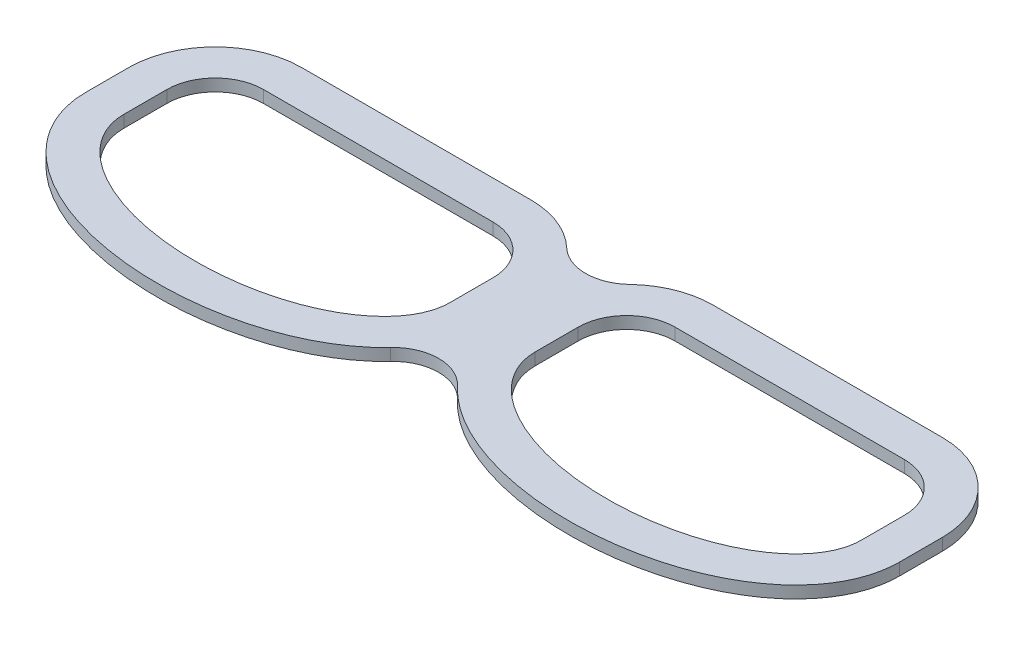
ISO-10303-21;
HEADER;
FILE_DESCRIPTION(('STEP AP214'),'2;1');
FILE_NAME('part.step','',(''),(''),'','','');
FILE_SCHEMA(('AUTOMOTIVE_DESIGN { 1 0 10303 214 1 1 1 1 }'));
ENDSEC;
DATA;
#1=APPLICATION_CONTEXT('core data for automotive mechanical design processes');
#2=APPLICATION_PROTOCOL_DEFINITION('international standard','automotive_design',2000,#1);
#3=PRODUCT_CONTEXT('',#1,'mechanical');
#4=PRODUCT('Part','Part','',(#3));
#5=PRODUCT_RELATED_PRODUCT_CATEGORY('part','',(#4));
#6=PRODUCT_DEFINITION_FORMATION('','',#4);
#7=PRODUCT_DEFINITION_CONTEXT('part definition',#1,'design');
#8=PRODUCT_DEFINITION('design','',#6,#7);
#9=PRODUCT_DEFINITION_SHAPE('','',#8);
#10=(LENGTH_UNIT() NAMED_UNIT(*) SI_UNIT(.MILLI.,.METRE.));
#11=(NAMED_UNIT(*) PLANE_ANGLE_UNIT() SI_UNIT($,.RADIAN.));
#12=(NAMED_UNIT(*) SI_UNIT($,.STERADIAN.) SOLID_ANGLE_UNIT());
#13=UNCERTAINTY_MEASURE_WITH_UNIT(LENGTH_MEASURE(1.E-05),#10,'distance_accuracy_value','');
#14=(GEOMETRIC_REPRESENTATION_CONTEXT(3) GLOBAL_UNCERTAINTY_ASSIGNED_CONTEXT((#13)) GLOBAL_UNIT_ASSIGNED_CONTEXT((#10,
#11,#12)) REPRESENTATION_CONTEXT('',''));
#15=CARTESIAN_POINT('',(0.,0.,0.));
#16=DIRECTION('',(0.,0.,1.));
#17=DIRECTION('',(1.,0.,0.));
#18=AXIS2_PLACEMENT_3D('',#15,#16,#17);
#19=CARTESIAN_POINT('',(-36.675,-3.175,-34.325));
#20=DIRECTION('',(0.,1.,0.));
#21=DIRECTION('',(0.,0.,1.));
#22=AXIS2_PLACEMENT_3D('',#19,#20,#21);
#23=CYLINDRICAL_SURFACE('',#22,3.175);
#24=DIRECTION('',(0.,1.,0.));
#25=VECTOR('',#24,1.);
#26=CARTESIAN_POINT('',(-36.675,-3.175,-37.5));
#27=LINE('',#26,#25);
#28=CARTESIAN_POINT('',(-36.675,0.,-37.5));
#29=VERTEX_POINT('',#28);
#30=CARTESIAN_POINT('',(-36.675,0.79375,-37.5));
#31=VERTEX_POINT('',#30);
#32=EDGE_CURVE('E282',#29,#31,#27,.T.);
#33=ORIENTED_EDGE('',*,*,#32,.F.);
#34=CARTESIAN_POINT('',(-36.675,0.,-34.325));
#35=DIRECTION('',(0.,1.,0.));
#36=DIRECTION('',(0.,0.,1.));
#37=AXIS2_PLACEMENT_3D('',#34,#35,#36);
#38=CIRCLE('',#37,3.175);
#39=CARTESIAN_POINT('',(-33.5,0.,-34.325));
#40=VERTEX_POINT('',#39);
#41=EDGE_CURVE('E76',#29,#40,#38,.F.);
#42=ORIENTED_EDGE('',*,*,#41,.T.);
#43=DIRECTION('',(0.,1.,0.));
#44=VECTOR('',#43,1.);
#45=CARTESIAN_POINT('',(-33.5,-3.175,-34.325));
#46=LINE('',#45,#44);
#47=CARTESIAN_POINT('',(-33.5,0.79375,-34.325));
#48=VERTEX_POINT('',#47);
#49=EDGE_CURVE('E281',#40,#48,#46,.T.);
#50=ORIENTED_EDGE('',*,*,#49,.T.);
#51=CARTESIAN_POINT('',(-36.675,0.79375,-34.325));
#52=DIRECTION('',(0.,1.,0.));
#53=DIRECTION('',(0.,0.,1.));
#54=AXIS2_PLACEMENT_3D('',#51,#52,#53);
#55=CIRCLE('',#54,3.175);
#56=EDGE_CURVE('E402',#48,#31,#55,.T.);
#57=ORIENTED_EDGE('',*,*,#56,.T.);
#58=EDGE_LOOP('',(#33,#42,#50,#57));
#59=FACE_BOUND('',#58,.T.);
#60=ADVANCED_FACE('F59',(#59),#23,.F.);
#61=CARTESIAN_POINT('',(-33.5,-3.175,-34.325));
#62=DIRECTION('',(1.,0.,0.));
#63=DIRECTION('',(0.,0.,-1.));
#64=AXIS2_PLACEMENT_3D('',#61,#62,#63);
#65=PLANE('',#64);
#66=ORIENTED_EDGE('',*,*,#49,.F.);
#67=DIRECTION('',(0.,0.,1.));
#68=VECTOR('',#67,1.);
#69=CARTESIAN_POINT('',(-33.5,0.,-34.325));
#70=LINE('',#69,#68);
#71=CARTESIAN_POINT('',(-33.5,0.,-31.5));
#72=VERTEX_POINT('',#71);
#73=EDGE_CURVE('E369',#40,#72,#70,.T.);
#74=ORIENTED_EDGE('',*,*,#73,.T.);
#75=DIRECTION('',(0.,1.,0.));
#76=VECTOR('',#75,1.);
#77=CARTESIAN_POINT('',(-33.5,-3.175,-31.5));
#78=LINE('',#77,#76);
#79=CARTESIAN_POINT('',(-33.5,0.79375,-31.5));
#80=VERTEX_POINT('',#79);
#81=EDGE_CURVE('E291',#72,#80,#78,.T.);
#82=ORIENTED_EDGE('',*,*,#81,.T.);
#83=DIRECTION('',(0.,0.,-1.));
#84=VECTOR('',#83,1.);
#85=CARTESIAN_POINT('',(-33.5,0.79375,-31.5));
#86=LINE('',#85,#84);
#87=EDGE_CURVE('E399',#80,#48,#86,.T.);
#88=ORIENTED_EDGE('',*,*,#87,.T.);
#89=EDGE_LOOP('',(#66,#74,#82,#88));
#90=FACE_BOUND('',#89,.T.);
#91=ADVANCED_FACE('F302',(#90),#65,.F.);
#92=CARTESIAN_POINT('',(-44.2,-3.175,-31.5));
#93=DIRECTION('',(0.,1.,0.));
#94=DIRECTION('',(-1.,0.,0.));
#95=AXIS2_PLACEMENT_3D('',#92,#93,#94);
#96=ELLIPSE('',#95,10.7,6.);
#97=DIRECTION('',(0.,1.,0.));
#98=VECTOR('',#97,1.);
#99=SURFACE_OF_LINEAR_EXTRUSION('',#96,#98);
#100=ORIENTED_EDGE('',*,*,#81,.F.);
#101=CARTESIAN_POINT('',(-44.2,0.,-31.5));
#102=DIRECTION('',(0.,1.,0.));
#103=DIRECTION('',(-1.,0.,0.));
#104=AXIS2_PLACEMENT_3D('',#101,#102,#103);
#105=ELLIPSE('',#104,10.7,6.);
#106=CARTESIAN_POINT('',(-54.9,0.,-31.5));
#107=VERTEX_POINT('',#106);
#108=EDGE_CURVE('E367',#72,#107,#105,.F.);
#109=ORIENTED_EDGE('',*,*,#108,.T.);
#110=DIRECTION('',(0.,1.,0.));
#111=VECTOR('',#110,1.);
#112=CARTESIAN_POINT('',(-54.9,-3.175,-31.5));
#113=LINE('',#112,#111);
#114=CARTESIAN_POINT('',(-54.9,0.79375,-31.5));
#115=VERTEX_POINT('',#114);
#116=EDGE_CURVE('E289',#107,#115,#113,.T.);
#117=ORIENTED_EDGE('',*,*,#116,.T.);
#118=CARTESIAN_POINT('',(-44.2,0.79375,-31.5));
#119=DIRECTION('',(0.,1.,0.));
#120=DIRECTION('',(-1.,0.,0.));
#121=AXIS2_PLACEMENT_3D('',#118,#119,#120);
#122=ELLIPSE('',#121,10.7,6.);
#123=EDGE_CURVE('E396',#115,#80,#122,.T.);
#124=ORIENTED_EDGE('',*,*,#123,.T.);
#125=EDGE_LOOP('',(#100,#109,#117,#124));
#126=FACE_BOUND('',#125,.T.);
#127=ADVANCED_FACE('F297',(#126),#99,.F.);
#128=CARTESIAN_POINT('',(-54.9,-3.175,-34.325));
#129=DIRECTION('',(-1.,0.,0.));
#130=DIRECTION('',(0.,0.,1.));
#131=AXIS2_PLACEMENT_3D('',#128,#129,#130);
#132=PLANE('',#131);
#133=ORIENTED_EDGE('',*,*,#116,.F.);
#134=DIRECTION('',(0.,0.,-1.));
#135=VECTOR('',#134,1.);
#136=CARTESIAN_POINT('',(-54.9,0.,-34.325));
#137=LINE('',#136,#135);
#138=CARTESIAN_POINT('',(-54.9,0.,-34.325));
#139=VERTEX_POINT('',#138);
#140=EDGE_CURVE('E365',#107,#139,#137,.T.);
#141=ORIENTED_EDGE('',*,*,#140,.T.);
#142=DIRECTION('',(0.,1.,0.));
#143=VECTOR('',#142,1.);
#144=CARTESIAN_POINT('',(-54.9,-3.175,-34.325));
#145=LINE('',#144,#143);
#146=CARTESIAN_POINT('',(-54.9,0.79375,-34.325));
#147=VERTEX_POINT('',#146);
#148=EDGE_CURVE('E287',#139,#147,#145,.T.);
#149=ORIENTED_EDGE('',*,*,#148,.T.);
#150=DIRECTION('',(0.,0.,1.));
#151=VECTOR('',#150,1.);
#152=CARTESIAN_POINT('',(-54.9,0.79375,-34.325));
#153=LINE('',#152,#151);
#154=EDGE_CURVE('E363',#147,#115,#153,.T.);
#155=ORIENTED_EDGE('',*,*,#154,.T.);
#156=EDGE_LOOP('',(#133,#141,#149,#155));
#157=FACE_BOUND('',#156,.T.);
#158=ADVANCED_FACE('F301',(#157),#132,.F.);
#159=CARTESIAN_POINT('',(-51.725,-3.175,-34.325));
#160=DIRECTION('',(0.,1.,0.));
#161=DIRECTION('',(0.,0.,1.));
#162=AXIS2_PLACEMENT_3D('',#159,#160,#161);
#163=CYLINDRICAL_SURFACE('',#162,3.175);
#164=ORIENTED_EDGE('',*,*,#148,.F.);
#165=CARTESIAN_POINT('',(-51.725,0.,-34.325));
#166=DIRECTION('',(0.,1.,0.));
#167=DIRECTION('',(0.,0.,1.));
#168=AXIS2_PLACEMENT_3D('',#165,#166,#167);
#169=CIRCLE('',#168,3.175);
#170=CARTESIAN_POINT('',(-51.725,0.,-37.5));
#171=VERTEX_POINT('',#170);
#172=EDGE_CURVE('E355',#139,#171,#169,.F.);
#173=ORIENTED_EDGE('',*,*,#172,.T.);
#174=DIRECTION('',(0.,1.,0.));
#175=VECTOR('',#174,1.);
#176=CARTESIAN_POINT('',(-51.725,-3.175,-37.5));
#177=LINE('',#176,#175);
#178=CARTESIAN_POINT('',(-51.725,0.79375,-37.5));
#179=VERTEX_POINT('',#178);
#180=EDGE_CURVE('E285',#171,#179,#177,.T.);
#181=ORIENTED_EDGE('',*,*,#180,.T.);
#182=CARTESIAN_POINT('',(-51.725,0.79375,-34.325));
#183=DIRECTION('',(0.,1.,0.));
#184=DIRECTION('',(0.,0.,1.));
#185=AXIS2_PLACEMENT_3D('',#182,#183,#184);
#186=CIRCLE('',#185,3.175);
#187=EDGE_CURVE('E358',#179,#147,#186,.T.);
#188=ORIENTED_EDGE('',*,*,#187,.T.);
#189=EDGE_LOOP('',(#164,#173,#181,#188));
#190=FACE_BOUND('',#189,.T.);
#191=ADVANCED_FACE('F344',(#190),#163,.F.);
#192=CARTESIAN_POINT('',(-36.675,-3.175,-37.5));
#193=DIRECTION('',(0.,0.,-1.));
#194=DIRECTION('',(-1.,0.,0.));
#195=AXIS2_PLACEMENT_3D('',#192,#193,#194);
#196=PLANE('',#195);
#197=ORIENTED_EDGE('',*,*,#180,.F.);
#198=DIRECTION('',(1.,0.,0.));
#199=VECTOR('',#198,1.);
#200=CARTESIAN_POINT('',(-36.675,0.,-37.5));
#201=LINE('',#200,#199);
#202=EDGE_CURVE('E371',#171,#29,#201,.T.);
#203=ORIENTED_EDGE('',*,*,#202,.T.);
#204=ORIENTED_EDGE('',*,*,#32,.T.);
#205=DIRECTION('',(-1.,0.,0.));
#206=VECTOR('',#205,1.);
#207=CARTESIAN_POINT('',(-36.675,0.79375,-37.5));
#208=LINE('',#207,#206);
#209=EDGE_CURVE('E405',#31,#179,#208,.T.);
#210=ORIENTED_EDGE('',*,*,#209,.T.);
#211=EDGE_LOOP('',(#197,#203,#204,#210));
#212=FACE_BOUND('',#211,.T.);
#213=ADVANCED_FACE('F311',(#212),#196,.F.);
#214=CARTESIAN_POINT('',(-24.725,-3.175,-34.325));
#215=DIRECTION('',(0.,1.,0.));
#216=DIRECTION('',(0.,0.,1.));
#217=AXIS2_PLACEMENT_3D('',#214,#215,#216);
#218=CYLINDRICAL_SURFACE('',#217,3.175);
#219=DIRECTION('',(0.,1.,0.));
#220=VECTOR('',#219,1.);
#221=CARTESIAN_POINT('',(-27.9,-3.175,-34.325));
#222=LINE('',#221,#220);
#223=CARTESIAN_POINT('',(-27.9,0.,-34.325));
#224=VERTEX_POINT('',#223);
#225=CARTESIAN_POINT('',(-27.9,0.79375,-34.325));
#226=VERTEX_POINT('',#225);
#227=EDGE_CURVE('E12',#224,#226,#222,.T.);
#228=ORIENTED_EDGE('',*,*,#227,.F.);
#229=CARTESIAN_POINT('',(-24.725,0.,-34.325));
#230=DIRECTION('',(0.,1.,0.));
#231=DIRECTION('',(0.,0.,1.));
#232=AXIS2_PLACEMENT_3D('',#229,#230,#231);
#233=CIRCLE('',#232,3.175);
#234=CARTESIAN_POINT('',(-24.725,0.,-37.5));
#235=VERTEX_POINT('',#234);
#236=EDGE_CURVE('E84',#224,#235,#233,.F.);
#237=ORIENTED_EDGE('',*,*,#236,.T.);
#238=DIRECTION('',(0.,1.,0.));
#239=VECTOR('',#238,1.);
#240=CARTESIAN_POINT('',(-24.725,-3.175,-37.5));
#241=LINE('',#240,#239);
#242=CARTESIAN_POINT('',(-24.725,0.79375,-37.5));
#243=VERTEX_POINT('',#242);
#244=EDGE_CURVE('E284',#235,#243,#241,.T.);
#245=ORIENTED_EDGE('',*,*,#244,.T.);
#246=CARTESIAN_POINT('',(-24.725,0.79375,-34.325));
#247=DIRECTION('',(0.,1.,0.));
#248=DIRECTION('',(0.,0.,1.));
#249=AXIS2_PLACEMENT_3D('',#246,#247,#248);
#250=CIRCLE('',#249,3.175);
#251=EDGE_CURVE('E378',#243,#226,#250,.T.);
#252=ORIENTED_EDGE('',*,*,#251,.T.);
#253=EDGE_LOOP('',(#228,#237,#245,#252));
#254=FACE_BOUND('',#253,.T.);
#255=ADVANCED_FACE('F308',(#254),#218,.F.);
#256=CARTESIAN_POINT('',(-9.67499999999999,-3.175,-37.5));
#257=DIRECTION('',(0.,0.,-1.));
#258=DIRECTION('',(-1.,0.,0.));
#259=AXIS2_PLACEMENT_3D('',#256,#257,#258);
#260=PLANE('',#259);
#261=ORIENTED_EDGE('',*,*,#244,.F.);
#262=DIRECTION('',(1.,0.,0.));
#263=VECTOR('',#262,1.);
#264=CARTESIAN_POINT('',(-9.67499999999999,0.,-37.5));
#265=LINE('',#264,#263);
#266=CARTESIAN_POINT('',(-9.67499999999999,0.,-37.5));
#267=VERTEX_POINT('',#266);
#268=EDGE_CURVE('E761',#235,#267,#265,.T.);
#269=ORIENTED_EDGE('',*,*,#268,.T.);
#270=DIRECTION('',(0.,1.,0.));
#271=VECTOR('',#270,1.);
#272=CARTESIAN_POINT('',(-9.67499999999999,-3.175,-37.5));
#273=LINE('',#272,#271);
#274=CARTESIAN_POINT('',(-9.675,0.79375,-37.5));
#275=VERTEX_POINT('',#274);
#276=EDGE_CURVE('E741',#267,#275,#273,.T.);
#277=ORIENTED_EDGE('',*,*,#276,.T.);
#278=DIRECTION('',(-1.,0.,0.));
#279=VECTOR('',#278,1.);
#280=CARTESIAN_POINT('',(-9.67499999999999,0.79375,-37.5));
#281=LINE('',#280,#279);
#282=EDGE_CURVE('E393',#275,#243,#281,.T.);
#283=ORIENTED_EDGE('',*,*,#282,.T.);
#284=EDGE_LOOP('',(#261,#269,#277,#283));
#285=FACE_BOUND('',#284,.T.);
#286=ADVANCED_FACE('F61',(#285),#260,.F.);
#287=CARTESIAN_POINT('',(-9.67499999999999,-3.175,-34.325));
#288=DIRECTION('',(0.,1.,0.));
#289=DIRECTION('',(0.,0.,1.));
#290=AXIS2_PLACEMENT_3D('',#287,#288,#289);
#291=CYLINDRICAL_SURFACE('',#290,3.175);
#292=ORIENTED_EDGE('',*,*,#276,.F.);
#293=CARTESIAN_POINT('',(-9.67499999999999,0.,-34.325));
#294=DIRECTION('',(0.,1.,0.));
#295=DIRECTION('',(0.,0.,1.));
#296=AXIS2_PLACEMENT_3D('',#293,#294,#295);
#297=CIRCLE('',#296,3.175);
#298=CARTESIAN_POINT('',(-6.49999999999999,0.,-34.325));
#299=VERTEX_POINT('',#298);
#300=EDGE_CURVE('E746',#267,#299,#297,.F.);
#301=ORIENTED_EDGE('',*,*,#300,.T.);
#302=DIRECTION('',(0.,1.,0.));
#303=VECTOR('',#302,1.);
#304=CARTESIAN_POINT('',(-6.49999999999999,-3.175,-34.325));
#305=LINE('',#304,#303);
#306=CARTESIAN_POINT('',(-6.49999999999999,0.79375,-34.325));
#307=VERTEX_POINT('',#306);
#308=EDGE_CURVE('E745',#299,#307,#305,.T.);
#309=ORIENTED_EDGE('',*,*,#308,.T.);
#310=CARTESIAN_POINT('',(-9.67499999999999,0.79375,-34.325));
#311=DIRECTION('',(0.,1.,0.));
#312=DIRECTION('',(0.,0.,1.));
#313=AXIS2_PLACEMENT_3D('',#310,#311,#312);
#314=CIRCLE('',#313,3.175);
#315=EDGE_CURVE('E390',#307,#275,#314,.T.);
#316=ORIENTED_EDGE('',*,*,#315,.T.);
#317=EDGE_LOOP('',(#292,#301,#309,#316));
#318=FACE_BOUND('',#317,.T.);
#319=ADVANCED_FACE('F324',(#318),#291,.F.);
#320=CARTESIAN_POINT('',(-6.49999999999998,-3.175,-31.5));
#321=DIRECTION('',(1.,0.,0.));
#322=DIRECTION('',(0.,0.,-1.));
#323=AXIS2_PLACEMENT_3D('',#320,#321,#322);
#324=PLANE('',#323);
#325=ORIENTED_EDGE('',*,*,#308,.F.);
#326=DIRECTION('',(0.,0.,1.));
#327=VECTOR('',#326,1.);
#328=CARTESIAN_POINT('',(-6.49999999999998,0.,-31.5));
#329=LINE('',#328,#327);
#330=CARTESIAN_POINT('',(-6.49999999999998,0.,-31.5));
#331=VERTEX_POINT('',#330);
#332=EDGE_CURVE('E751',#299,#331,#329,.T.);
#333=ORIENTED_EDGE('',*,*,#332,.T.);
#334=DIRECTION('',(0.,1.,0.));
#335=VECTOR('',#334,1.);
#336=CARTESIAN_POINT('',(-6.49999999999998,-3.175,-31.5));
#337=LINE('',#336,#335);
#338=CARTESIAN_POINT('',(-6.49999999999998,0.79375,-31.5));
#339=VERTEX_POINT('',#338);
#340=EDGE_CURVE('E748',#331,#339,#337,.T.);
#341=ORIENTED_EDGE('',*,*,#340,.T.);
#342=DIRECTION('',(0.,0.,-1.));
#343=VECTOR('',#342,1.);
#344=CARTESIAN_POINT('',(-6.49999999999998,0.79375,-31.5));
#345=LINE('',#344,#343);
#346=EDGE_CURVE('E387',#339,#307,#345,.T.);
#347=ORIENTED_EDGE('',*,*,#346,.T.);
#348=EDGE_LOOP('',(#325,#333,#341,#347));
#349=FACE_BOUND('',#348,.T.);
#350=ADVANCED_FACE('F321',(#349),#324,.F.);
#351=CARTESIAN_POINT('',(-17.2,-3.175,-31.5));
#352=DIRECTION('',(0.,1.,0.));
#353=DIRECTION('',(-1.,0.,0.));
#354=AXIS2_PLACEMENT_3D('',#351,#352,#353);
#355=ELLIPSE('',#354,10.7,6.);
#356=DIRECTION('',(0.,1.,0.));
#357=VECTOR('',#356,1.);
#358=SURFACE_OF_LINEAR_EXTRUSION('',#355,#357);
#359=ORIENTED_EDGE('',*,*,#340,.F.);
#360=CARTESIAN_POINT('',(-17.2,0.,-31.5));
#361=DIRECTION('',(0.,1.,0.));
#362=DIRECTION('',(-1.,0.,0.));
#363=AXIS2_PLACEMENT_3D('',#360,#361,#362);
#364=ELLIPSE('',#363,10.7,6.);
#365=CARTESIAN_POINT('',(-27.9,0.,-31.5));
#366=VERTEX_POINT('',#365);
#367=EDGE_CURVE('E754',#331,#366,#364,.F.);
#368=ORIENTED_EDGE('',*,*,#367,.T.);
#369=DIRECTION('',(0.,1.,0.));
#370=VECTOR('',#369,1.);
#371=CARTESIAN_POINT('',(-27.9,-3.175,-31.5));
#372=LINE('',#371,#370);
#373=CARTESIAN_POINT('',(-27.9,0.79375,-31.5));
#374=VERTEX_POINT('',#373);
#375=EDGE_CURVE('E68',#366,#374,#372,.T.);
#376=ORIENTED_EDGE('',*,*,#375,.T.);
#377=CARTESIAN_POINT('',(-17.2,0.79375,-31.5));
#378=DIRECTION('',(0.,1.,0.));
#379=DIRECTION('',(-1.,0.,0.));
#380=AXIS2_PLACEMENT_3D('',#377,#378,#379);
#381=ELLIPSE('',#380,10.7,6.);
#382=EDGE_CURVE('E384',#374,#339,#381,.T.);
#383=ORIENTED_EDGE('',*,*,#382,.T.);
#384=EDGE_LOOP('',(#359,#368,#376,#383));
#385=FACE_BOUND('',#384,.T.);
#386=ADVANCED_FACE('F317',(#385),#358,.F.);
#387=CARTESIAN_POINT('',(-27.9,-3.175,-34.325));
#388=DIRECTION('',(-1.,0.,0.));
#389=DIRECTION('',(0.,0.,1.));
#390=AXIS2_PLACEMENT_3D('',#387,#388,#389);
#391=PLANE('',#390);
#392=ORIENTED_EDGE('',*,*,#375,.F.);
#393=DIRECTION('',(0.,0.,-1.));
#394=VECTOR('',#393,1.);
#395=CARTESIAN_POINT('',(-27.9,0.,-34.325));
#396=LINE('',#395,#394);
#397=EDGE_CURVE('E738',#366,#224,#396,.T.);
#398=ORIENTED_EDGE('',*,*,#397,.T.);
#399=ORIENTED_EDGE('',*,*,#227,.T.);
#400=DIRECTION('',(0.,0.,1.));
#401=VECTOR('',#400,1.);
#402=CARTESIAN_POINT('',(-27.9,0.79375,-34.325));
#403=LINE('',#402,#401);
#404=EDGE_CURVE('E381',#226,#374,#403,.T.);
#405=ORIENTED_EDGE('',*,*,#404,.T.);
#406=EDGE_LOOP('',(#392,#398,#399,#405));
#407=FACE_BOUND('',#406,.T.);
#408=ADVANCED_FACE('F313',(#407),#391,.F.);
#409=CARTESIAN_POINT('',(-36.675,0.79375,-34.325));
#410=DIRECTION('',(0.,1.,0.));
#411=DIRECTION('',(0.,0.,1.));
#412=AXIS2_PLACEMENT_3D('',#409,#410,#411);
#413=PLANE('',#412);
#414=CARTESIAN_POINT('',(-36.675,0.79375,-34.325));
#415=DIRECTION('',(0.,1.,0.));
#416=DIRECTION('',(0.,0.,1.));
#417=AXIS2_PLACEMENT_3D('',#414,#415,#416);
#418=CIRCLE('',#417,5.675);
#419=CARTESIAN_POINT('',(-32.7662824207493,0.79375,-38.4393106209493));
#420=VERTEX_POINT('',#419);
#421=CARTESIAN_POINT('',(-36.675,0.79375,-40.));
#422=VERTEX_POINT('',#421);
#423=EDGE_CURVE('E231',#420,#422,#418,.T.);
#424=ORIENTED_EDGE('',*,*,#423,.T.);
#425=DIRECTION('',(-1.,0.,0.));
#426=VECTOR('',#425,1.);
#427=CARTESIAN_POINT('',(-36.675,0.79375,-40.));
#428=LINE('',#427,#426);
#429=CARTESIAN_POINT('',(-51.725,0.79375,-40.));
#430=VERTEX_POINT('',#429);
#431=EDGE_CURVE('E412',#422,#430,#428,.T.);
#432=ORIENTED_EDGE('',*,*,#431,.T.);
#433=CARTESIAN_POINT('',(-51.725,0.79375,-34.325));
#434=DIRECTION('',(0.,1.,0.));
#435=DIRECTION('',(0.,0.,1.));
#436=AXIS2_PLACEMENT_3D('',#433,#434,#435);
#437=CIRCLE('',#436,5.675);
#438=CARTESIAN_POINT('',(-57.4,0.79375,-34.325));
#439=VERTEX_POINT('',#438);
#440=EDGE_CURVE('E414',#430,#439,#437,.T.);
#441=ORIENTED_EDGE('',*,*,#440,.T.);
#442=DIRECTION('',(0.,0.,1.));
#443=VECTOR('',#442,1.);
#444=CARTESIAN_POINT('',(-57.4,0.79375,-34.325));
#445=LINE('',#444,#443);
#446=CARTESIAN_POINT('',(-57.4,0.79375,-31.5));
#447=VERTEX_POINT('',#446);
#448=EDGE_CURVE('E416',#439,#447,#445,.T.);
#449=ORIENTED_EDGE('',*,*,#448,.T.);
#450=CARTESIAN_POINT('',(-57.4,0.79375,-31.5));
#451=CARTESIAN_POINT('',(-57.4,0.79375,-30.8211542785592));
#452=CARTESIAN_POINT('',(-57.1531758961031,0.79375,-29.4471430814434));
#453=CARTESIAN_POINT('',(-56.1672129380606,0.79375,-27.6652704838865));
#454=CARTESIAN_POINT('',(-54.756272744858,0.79375,-26.2028137764362));
#455=CARTESIAN_POINT('',(-52.4554539835107,0.79375,-24.6429956011683));
#456=CARTESIAN_POINT('',(-48.9514289418349,0.79375,-23.3508154890305));
#457=CARTESIAN_POINT('',(-44.2,0.79375,-22.8245922554847));
#458=CARTESIAN_POINT('',(-39.4485710581651,0.79375,-23.3508154890305));
#459=CARTESIAN_POINT('',(-35.9445460164892,0.79375,-24.6429956011683));
#460=CARTESIAN_POINT('',(-34.0499031083979,0.79375,-25.9274507235496));
#461=CARTESIAN_POINT('',(-33.140035296487,0.79375,-26.7400402203476));
#462=CARTESIAN_POINT('',(-32.6582671373628,0.79375,-27.254488613723));
#463=CARTESIAN_POINT('',(-31.9565398898826,0.79375,-28.1624182814758));
#464=CARTESIAN_POINT('',(-31.2414114257777,0.79375,-29.4772741757112));
#465=CARTESIAN_POINT('',(-31.,0.79375,-30.8211542785592));
#466=CARTESIAN_POINT('',(-31.,0.79375,-31.5));
#467=B_SPLINE_CURVE_WITH_KNOTS('',3,(#450,#451,#452,#453,#454,#455,#456,#457,#458,#459,#460,
#461,#462,#463,#464,#465,#466),.UNSPECIFIED.,.F.,.F.,(4,1,1,1,1,1,1,1,1,1,1,1,1,1,4),(0.,
0.196349540849362,0.392699081698724,0.589048622548086,0.785398163397448,1.17809724509617,
1.5707963267949,1.96349540849362,2.35619449019234,2.55254403104171,2.61024302951772,
2.7084177999424,2.75750518515474,2.94524311274043,3.14159265358979),.UNSPECIFIED.);
#468=CARTESIAN_POINT('',(-32.8929216775254,0.79375,-27.0112789099346));
#469=VERTEX_POINT('',#468);
#470=EDGE_CURVE('E418',#447,#469,#467,.T.);
#471=ORIENTED_EDGE('',*,*,#470,.T.);
#472=CARTESIAN_POINT('',(-30.7,0.79375,-24.9640626252595));
#473=DIRECTION('',(0.,-1.,0.));
#474=DIRECTION('',(0.,0.,1.));
#475=AXIS2_PLACEMENT_3D('',#472,#473,#474);
#476=CIRCLE('',#475,3.);
#477=CARTESIAN_POINT('',(-28.5070783224745,0.79375,-27.0112789099346));
#478=VERTEX_POINT('',#477);
#479=EDGE_CURVE('E423',#469,#478,#476,.T.);
#480=ORIENTED_EDGE('',*,*,#479,.T.);
#481=CARTESIAN_POINT('',(-30.4,0.79375,-31.5));
#482=CARTESIAN_POINT('',(-30.4,0.79375,-30.8211542785592));
#483=CARTESIAN_POINT('',(-30.1585885742223,0.79375,-29.4772741757112));
#484=CARTESIAN_POINT('',(-29.4434601101173,0.79375,-28.1624182814758));
#485=CARTESIAN_POINT('',(-28.7417328626372,0.79375,-27.254488613723));
#486=CARTESIAN_POINT('',(-28.259964703513,0.79375,-26.7400402203476));
#487=CARTESIAN_POINT('',(-27.3500968916021,0.79375,-25.9274507235495));
#488=CARTESIAN_POINT('',(-25.4554539835108,0.79375,-24.6429956011683));
#489=CARTESIAN_POINT('',(-21.9514289418349,0.79375,-23.3508154890305));
#490=CARTESIAN_POINT('',(-17.2,0.79375,-22.8245922554847));
#491=CARTESIAN_POINT('',(-12.4485710581651,0.79375,-23.3508154890305));
#492=CARTESIAN_POINT('',(-8.94454601648922,0.79375,-24.6429956011683));
#493=CARTESIAN_POINT('',(-6.64372725514197,0.79375,-26.2028137764362));
#494=CARTESIAN_POINT('',(-5.23278706193934,0.79375,-27.6652704838865));
#495=CARTESIAN_POINT('',(-4.24682410389684,0.79375,-29.4471430814434));
#496=CARTESIAN_POINT('',(-3.99999999999998,0.79375,-30.8211542785592));
#497=CARTESIAN_POINT('',(-3.99999999999998,0.79375,-31.5));
#498=B_SPLINE_CURVE_WITH_KNOTS('',3,(#481,#482,#483,#484,#485,#486,#487,#488,#489,#490,#491,
#492,#493,#494,#495,#496,#497),.UNSPECIFIED.,.F.,.F.,(4,1,1,1,1,1,1,1,1,1,1,1,1,1,4),(0.,
0.196349540849362,0.384087468435052,0.433174853647393,0.531349624072074,0.589048622548086,
0.785398163397448,1.17809724509617,1.5707963267949,1.96349540849362,2.35619449019234,
2.55254403104171,2.74889357189107,2.94524311274043,3.14159265358979),.UNSPECIFIED.);
#499=CARTESIAN_POINT('',(-3.99999999999998,0.79375,-31.5));
#500=VERTEX_POINT('',#499);
#501=EDGE_CURVE('E509',#478,#500,#498,.T.);
#502=ORIENTED_EDGE('',*,*,#501,.T.);
#503=DIRECTION('',(0.,0.,-1.));
#504=VECTOR('',#503,1.);
#505=CARTESIAN_POINT('',(-3.99999999999998,0.79375,-31.5));
#506=LINE('',#505,#504);
#507=CARTESIAN_POINT('',(-3.99999999999999,0.79375,-34.325));
#508=VERTEX_POINT('',#507);
#509=EDGE_CURVE('E506',#500,#508,#506,.T.);
#510=ORIENTED_EDGE('',*,*,#509,.T.);
#511=CARTESIAN_POINT('',(-9.67499999999999,0.79375,-34.325));
#512=DIRECTION('',(0.,1.,0.));
#513=DIRECTION('',(0.,0.,1.));
#514=AXIS2_PLACEMENT_3D('',#511,#512,#513);
#515=CIRCLE('',#514,5.67500000000001);
#516=CARTESIAN_POINT('',(-9.67499999999999,0.79375,-40.));
#517=VERTEX_POINT('',#516);
#518=EDGE_CURVE('E504',#508,#517,#515,.T.);
#519=ORIENTED_EDGE('',*,*,#518,.T.);
#520=DIRECTION('',(-1.,0.,0.));
#521=VECTOR('',#520,1.);
#522=CARTESIAN_POINT('',(-9.67499999999999,0.79375,-40.));
#523=LINE('',#522,#521);
#524=CARTESIAN_POINT('',(-24.725,0.79375,-40.));
#525=VERTEX_POINT('',#524);
#526=EDGE_CURVE('E502',#517,#525,#523,.T.);
#527=ORIENTED_EDGE('',*,*,#526,.T.);
#528=CARTESIAN_POINT('',(-24.725,0.79375,-34.325));
#529=DIRECTION('',(0.,1.,0.));
#530=DIRECTION('',(0.,0.,1.));
#531=AXIS2_PLACEMENT_3D('',#528,#529,#530);
#532=CIRCLE('',#531,5.67500000000001);
#533=CARTESIAN_POINT('',(-28.6337175792507,0.79375,-38.4393106209493));
#534=VERTEX_POINT('',#533);
#535=EDGE_CURVE('E503',#525,#534,#532,.T.);
#536=ORIENTED_EDGE('',*,*,#535,.T.);
#537=CARTESIAN_POINT('',(-30.7,0.79375,-40.614276587971));
#538=DIRECTION('',(0.,-1.,0.));
#539=DIRECTION('',(0.,0.,1.));
#540=AXIS2_PLACEMENT_3D('',#537,#538,#539);
#541=CIRCLE('',#540,3.);
#542=EDGE_CURVE('E237',#534,#420,#541,.T.);
#543=ORIENTED_EDGE('',*,*,#542,.T.);
#544=EDGE_LOOP('',(#424,#432,#441,#449,#471,#480,#502,#510,#519,#527,#536,#543));
#545=FACE_BOUND('',#544,.T.);
#546=ORIENTED_EDGE('',*,*,#87,.F.);
#547=ORIENTED_EDGE('',*,*,#123,.F.);
#548=ORIENTED_EDGE('',*,*,#154,.F.);
#549=ORIENTED_EDGE('',*,*,#187,.F.);
#550=ORIENTED_EDGE('',*,*,#209,.F.);
#551=ORIENTED_EDGE('',*,*,#56,.F.);
#552=EDGE_LOOP('',(#546,#547,#548,#549,#550,#551));
#553=FACE_BOUND('',#552,.T.);
#554=ORIENTED_EDGE('',*,*,#404,.F.);
#555=ORIENTED_EDGE('',*,*,#251,.F.);
#556=ORIENTED_EDGE('',*,*,#282,.F.);
#557=ORIENTED_EDGE('',*,*,#315,.F.);
#558=ORIENTED_EDGE('',*,*,#346,.F.);
#559=ORIENTED_EDGE('',*,*,#382,.F.);
#560=EDGE_LOOP('',(#554,#555,#556,#557,#558,#559));
#561=FACE_BOUND('',#560,.T.);
#562=ADVANCED_FACE('F316',(#545,#553,#561),#413,.T.);
#563=CARTESIAN_POINT('',(-36.675,0.79375,-34.325));
#564=DIRECTION('',(0.,-1.,0.));
#565=DIRECTION('',(0.,0.,-1.));
#566=AXIS2_PLACEMENT_3D('',#563,#564,#565);
#567=CYLINDRICAL_SURFACE('',#566,5.675);
#568=CARTESIAN_POINT('',(-36.675,0.,-34.325));
#569=DIRECTION('',(0.,1.,0.));
#570=DIRECTION('',(0.,0.,1.));
#571=AXIS2_PLACEMENT_3D('',#568,#569,#570);
#572=CIRCLE('',#571,5.675);
#573=CARTESIAN_POINT('',(-32.7662824207493,0.,-38.4393106209493));
#574=VERTEX_POINT('',#573);
#575=CARTESIAN_POINT('',(-36.675,0.,-40.));
#576=VERTEX_POINT('',#575);
#577=EDGE_CURVE('E227',#574,#576,#572,.T.);
#578=ORIENTED_EDGE('',*,*,#577,.T.);
#579=DIRECTION('',(0.,-1.,0.));
#580=VECTOR('',#579,1.);
#581=CARTESIAN_POINT('',(-36.675,0.79375,-40.));
#582=LINE('',#581,#580);
#583=EDGE_CURVE('E278',#422,#576,#582,.T.);
#584=ORIENTED_EDGE('',*,*,#583,.F.);
#585=ORIENTED_EDGE('',*,*,#423,.F.);
#586=DIRECTION('',(0.,-1.,0.));
#587=VECTOR('',#586,1.);
#588=CARTESIAN_POINT('',(-32.7662824207493,0.79375,-38.4393106209493));
#589=LINE('',#588,#587);
#590=EDGE_CURVE('E241',#420,#574,#589,.T.);
#591=ORIENTED_EDGE('',*,*,#590,.T.);
#592=EDGE_LOOP('',(#578,#584,#585,#591));
#593=FACE_BOUND('',#592,.T.);
#594=ADVANCED_FACE('F341',(#593),#567,.T.);
#595=CARTESIAN_POINT('',(-36.675,0.79375,-40.));
#596=DIRECTION('',(0.,0.,1.));
#597=DIRECTION('',(1.,0.,0.));
#598=AXIS2_PLACEMENT_3D('',#595,#596,#597);
#599=PLANE('',#598);
#600=DIRECTION('',(-1.,0.,0.));
#601=VECTOR('',#600,1.);
#602=CARTESIAN_POINT('',(-36.675,0.,-40.));
#603=LINE('',#602,#601);
#604=CARTESIAN_POINT('',(-51.725,0.,-40.));
#605=VERTEX_POINT('',#604);
#606=EDGE_CURVE('E452',#576,#605,#603,.T.);
#607=ORIENTED_EDGE('',*,*,#606,.T.);
#608=DIRECTION('',(0.,-1.,0.));
#609=VECTOR('',#608,1.);
#610=CARTESIAN_POINT('',(-51.725,0.79375,-40.));
#611=LINE('',#610,#609);
#612=EDGE_CURVE('E275',#430,#605,#611,.T.);
#613=ORIENTED_EDGE('',*,*,#612,.F.);
#614=ORIENTED_EDGE('',*,*,#431,.F.);
#615=ORIENTED_EDGE('',*,*,#583,.T.);
#616=EDGE_LOOP('',(#607,#613,#614,#615));
#617=FACE_BOUND('',#616,.T.);
#618=ADVANCED_FACE('F442',(#617),#599,.F.);
#619=CARTESIAN_POINT('',(-51.725,0.79375,-34.325));
#620=DIRECTION('',(0.,-1.,0.));
#621=DIRECTION('',(0.,0.,-1.));
#622=AXIS2_PLACEMENT_3D('',#619,#620,#621);
#623=CYLINDRICAL_SURFACE('',#622,5.675);
#624=CARTESIAN_POINT('',(-51.725,0.,-34.325));
#625=DIRECTION('',(0.,1.,0.));
#626=DIRECTION('',(0.,0.,1.));
#627=AXIS2_PLACEMENT_3D('',#624,#625,#626);
#628=CIRCLE('',#627,5.675);
#629=CARTESIAN_POINT('',(-57.4,0.,-34.325));
#630=VERTEX_POINT('',#629);
#631=EDGE_CURVE('E455',#605,#630,#628,.T.);
#632=ORIENTED_EDGE('',*,*,#631,.T.);
#633=DIRECTION('',(0.,-1.,0.));
#634=VECTOR('',#633,1.);
#635=CARTESIAN_POINT('',(-57.4,0.79375,-34.325));
#636=LINE('',#635,#634);
#637=EDGE_CURVE('E272',#439,#630,#636,.T.);
#638=ORIENTED_EDGE('',*,*,#637,.F.);
#639=ORIENTED_EDGE('',*,*,#440,.F.);
#640=ORIENTED_EDGE('',*,*,#612,.T.);
#641=EDGE_LOOP('',(#632,#638,#639,#640));
#642=FACE_BOUND('',#641,.T.);
#643=ADVANCED_FACE('F439',(#642),#623,.T.);
#644=CARTESIAN_POINT('',(-57.4,0.79375,-34.325));
#645=DIRECTION('',(1.,0.,0.));
#646=DIRECTION('',(0.,0.,-1.));
#647=AXIS2_PLACEMENT_3D('',#644,#645,#646);
#648=PLANE('',#647);
#649=DIRECTION('',(0.,0.,1.));
#650=VECTOR('',#649,1.);
#651=CARTESIAN_POINT('',(-57.4,0.,-34.325));
#652=LINE('',#651,#650);
#653=CARTESIAN_POINT('',(-57.4,0.,-31.5));
#654=VERTEX_POINT('',#653);
#655=EDGE_CURVE('E469',#630,#654,#652,.T.);
#656=ORIENTED_EDGE('',*,*,#655,.T.);
#657=DIRECTION('',(0.,-1.,0.));
#658=VECTOR('',#657,1.);
#659=CARTESIAN_POINT('',(-57.4,0.79375,-31.5));
#660=LINE('',#659,#658);
#661=EDGE_CURVE('E269',#447,#654,#660,.T.);
#662=ORIENTED_EDGE('',*,*,#661,.F.);
#663=ORIENTED_EDGE('',*,*,#448,.F.);
#664=ORIENTED_EDGE('',*,*,#637,.T.);
#665=EDGE_LOOP('',(#656,#662,#663,#664));
#666=FACE_BOUND('',#665,.T.);
#667=ADVANCED_FACE('F434',(#666),#648,.F.);
#668=DIRECTION('',(0.,-1.,0.));
#669=VECTOR('',#668,1.);
#670=SURFACE_OF_LINEAR_EXTRUSION('',#467,#669);
#671=CARTESIAN_POINT('',(-57.4,0.,-31.5));
#672=CARTESIAN_POINT('',(-57.4,0.,-30.8211542785592));
#673=CARTESIAN_POINT('',(-57.1531758961031,0.,-29.4471430814434));
#674=CARTESIAN_POINT('',(-56.1672129380606,0.,-27.6652704838865));
#675=CARTESIAN_POINT('',(-54.756272744858,0.,-26.2028137764362));
#676=CARTESIAN_POINT('',(-52.4554539835107,0.,-24.6429956011683));
#677=CARTESIAN_POINT('',(-48.9514289418349,0.,-23.3508154890305));
#678=CARTESIAN_POINT('',(-44.2,0.,-22.8245922554847));
#679=CARTESIAN_POINT('',(-39.4485710581651,0.,-23.3508154890305));
#680=CARTESIAN_POINT('',(-35.9445460164892,0.,-24.6429956011683));
#681=CARTESIAN_POINT('',(-34.0499031083979,0.,-25.9274507235496));
#682=CARTESIAN_POINT('',(-33.140035296487,0.,-26.7400402203476));
#683=CARTESIAN_POINT('',(-32.6582671373628,0.,-27.254488613723));
#684=CARTESIAN_POINT('',(-31.9565398898826,0.,-28.1624182814758));
#685=CARTESIAN_POINT('',(-31.2414114257777,0.,-29.4772741757112));
#686=CARTESIAN_POINT('',(-31.,0.,-30.8211542785592));
#687=CARTESIAN_POINT('',(-31.,0.,-31.5));
#688=B_SPLINE_CURVE_WITH_KNOTS('',3,(#671,#672,#673,#674,#675,#676,#677,#678,#679,#680,#681,
#682,#683,#684,#685,#686,#687),.UNSPECIFIED.,.F.,.F.,(4,1,1,1,1,1,1,1,1,1,1,1,1,1,4),(0.,
0.196349540849362,0.392699081698724,0.589048622548086,0.785398163397448,1.17809724509617,
1.5707963267949,1.96349540849362,2.35619449019234,2.55254403104171,2.61024302951772,
2.7084177999424,2.75750518515474,2.94524311274043,3.14159265358979),.UNSPECIFIED.);
#689=CARTESIAN_POINT('',(-32.8929216775254,0.,-27.0112789099346));
#690=VERTEX_POINT('',#689);
#691=EDGE_CURVE('E472',#654,#690,#688,.T.);
#692=ORIENTED_EDGE('',*,*,#691,.T.);
#693=DIRECTION('',(0.,-1.,0.));
#694=VECTOR('',#693,1.);
#695=CARTESIAN_POINT('',(-32.8929216775254,0.79375,-27.0112789099346));
#696=LINE('',#695,#694);
#697=EDGE_CURVE('E266',#469,#690,#696,.T.);
#698=ORIENTED_EDGE('',*,*,#697,.F.);
#699=ORIENTED_EDGE('',*,*,#470,.F.);
#700=ORIENTED_EDGE('',*,*,#661,.T.);
#701=EDGE_LOOP('',(#692,#698,#699,#700));
#702=FACE_BOUND('',#701,.T.);
#703=ADVANCED_FACE('F429',(#702),#670,.F.);
#704=CARTESIAN_POINT('',(-30.7,0.79375,-24.9640626252595));
#705=DIRECTION('',(0.,-1.,0.));
#706=DIRECTION('',(0.,0.,-1.));
#707=AXIS2_PLACEMENT_3D('',#704,#705,#706);
#708=CYLINDRICAL_SURFACE('',#707,3.);
#709=CARTESIAN_POINT('',(-30.7,0.,-24.9640626252595));
#710=DIRECTION('',(0.,-1.,0.));
#711=DIRECTION('',(0.,0.,1.));
#712=AXIS2_PLACEMENT_3D('',#709,#710,#711);
#713=CIRCLE('',#712,3.);
#714=CARTESIAN_POINT('',(-28.5070783224744,0.,-27.0112789099345));
#715=VERTEX_POINT('',#714);
#716=EDGE_CURVE('E477',#690,#715,#713,.T.);
#717=ORIENTED_EDGE('',*,*,#716,.T.);
#718=DIRECTION('',(0.,-1.,0.));
#719=VECTOR('',#718,1.);
#720=CARTESIAN_POINT('',(-28.5070783224745,0.79375,-27.0112789099346));
#721=LINE('',#720,#719);
#722=EDGE_CURVE('E263',#478,#715,#721,.T.);
#723=ORIENTED_EDGE('',*,*,#722,.F.);
#724=ORIENTED_EDGE('',*,*,#479,.F.);
#725=ORIENTED_EDGE('',*,*,#697,.T.);
#726=EDGE_LOOP('',(#717,#723,#724,#725));
#727=FACE_BOUND('',#726,.T.);
#728=ADVANCED_FACE('F433',(#727),#708,.F.);
#729=DIRECTION('',(0.,-1.,0.));
#730=VECTOR('',#729,1.);
#731=SURFACE_OF_LINEAR_EXTRUSION('',#498,#730);
#732=CARTESIAN_POINT('',(-30.4,0.,-31.5));
#733=CARTESIAN_POINT('',(-30.4,0.,-30.8211542785592));
#734=CARTESIAN_POINT('',(-30.1585885742223,0.,-29.4772741757112));
#735=CARTESIAN_POINT('',(-29.4434601101173,0.,-28.1624182814758));
#736=CARTESIAN_POINT('',(-28.7417328626372,0.,-27.254488613723));
#737=CARTESIAN_POINT('',(-28.259964703513,0.,-26.7400402203476));
#738=CARTESIAN_POINT('',(-27.3500968916021,0.,-25.9274507235495));
#739=CARTESIAN_POINT('',(-25.4554539835108,0.,-24.6429956011683));
#740=CARTESIAN_POINT('',(-21.9514289418349,0.,-23.3508154890305));
#741=CARTESIAN_POINT('',(-17.2,0.,-22.8245922554847));
#742=CARTESIAN_POINT('',(-12.4485710581651,0.,-23.3508154890305));
#743=CARTESIAN_POINT('',(-8.94454601648922,0.,-24.6429956011683));
#744=CARTESIAN_POINT('',(-6.64372725514197,0.,-26.2028137764362));
#745=CARTESIAN_POINT('',(-5.23278706193934,0.,-27.6652704838865));
#746=CARTESIAN_POINT('',(-4.24682410389684,0.,-29.4471430814434));
#747=CARTESIAN_POINT('',(-3.99999999999998,0.,-30.8211542785592));
#748=CARTESIAN_POINT('',(-3.99999999999998,0.,-31.5));
#749=B_SPLINE_CURVE_WITH_KNOTS('',3,(#732,#733,#734,#735,#736,#737,#738,#739,#740,#741,#742,
#743,#744,#745,#746,#747,#748),.UNSPECIFIED.,.F.,.F.,(4,1,1,1,1,1,1,1,1,1,1,1,1,1,4),(0.,
0.196349540849362,0.384087468435052,0.433174853647393,0.531349624072074,0.589048622548086,
0.785398163397448,1.17809724509617,1.5707963267949,1.96349540849362,2.35619449019234,
2.55254403104171,2.74889357189107,2.94524311274043,3.14159265358979),.UNSPECIFIED.);
#750=CARTESIAN_POINT('',(-3.99999999999998,0.,-31.5));
#751=VERTEX_POINT('',#750);
#752=EDGE_CURVE('E483',#715,#751,#749,.T.);
#753=ORIENTED_EDGE('',*,*,#752,.T.);
#754=DIRECTION('',(0.,-1.,0.));
#755=VECTOR('',#754,1.);
#756=CARTESIAN_POINT('',(-3.99999999999998,0.79375,-31.5));
#757=LINE('',#756,#755);
#758=EDGE_CURVE('E260',#500,#751,#757,.T.);
#759=ORIENTED_EDGE('',*,*,#758,.F.);
#760=ORIENTED_EDGE('',*,*,#501,.F.);
#761=ORIENTED_EDGE('',*,*,#722,.T.);
#762=EDGE_LOOP('',(#753,#759,#760,#761));
#763=FACE_BOUND('',#762,.T.);
#764=ADVANCED_FACE('F516',(#763),#731,.F.);
#765=CARTESIAN_POINT('',(-3.99999999999998,0.79375,-31.5));
#766=DIRECTION('',(-1.,0.,0.));
#767=DIRECTION('',(0.,0.,1.));
#768=AXIS2_PLACEMENT_3D('',#765,#766,#767);
#769=PLANE('',#768);
#770=DIRECTION('',(0.,0.,-1.));
#771=VECTOR('',#770,1.);
#772=CARTESIAN_POINT('',(-3.99999999999998,0.,-31.5));
#773=LINE('',#772,#771);
#774=CARTESIAN_POINT('',(-3.99999999999999,0.,-34.325));
#775=VERTEX_POINT('',#774);
#776=EDGE_CURVE('E488',#751,#775,#773,.T.);
#777=ORIENTED_EDGE('',*,*,#776,.T.);
#778=DIRECTION('',(0.,-1.,0.));
#779=VECTOR('',#778,1.);
#780=CARTESIAN_POINT('',(-3.99999999999999,0.79375,-34.325));
#781=LINE('',#780,#779);
#782=EDGE_CURVE('E257',#508,#775,#781,.T.);
#783=ORIENTED_EDGE('',*,*,#782,.F.);
#784=ORIENTED_EDGE('',*,*,#509,.F.);
#785=ORIENTED_EDGE('',*,*,#758,.T.);
#786=EDGE_LOOP('',(#777,#783,#784,#785));
#787=FACE_BOUND('',#786,.T.);
#788=ADVANCED_FACE('F519',(#787),#769,.F.);
#789=CARTESIAN_POINT('',(-9.67499999999999,0.79375,-34.325));
#790=DIRECTION('',(0.,-1.,0.));
#791=DIRECTION('',(0.,0.,-1.));
#792=AXIS2_PLACEMENT_3D('',#789,#790,#791);
#793=CYLINDRICAL_SURFACE('',#792,5.67500000000001);
#794=CARTESIAN_POINT('',(-9.67499999999999,0.,-34.325));
#795=DIRECTION('',(0.,1.,0.));
#796=DIRECTION('',(0.,0.,1.));
#797=AXIS2_PLACEMENT_3D('',#794,#795,#796);
#798=CIRCLE('',#797,5.67500000000001);
#799=CARTESIAN_POINT('',(-9.67499999999999,0.,-40.));
#800=VERTEX_POINT('',#799);
#801=EDGE_CURVE('E248',#775,#800,#798,.T.);
#802=ORIENTED_EDGE('',*,*,#801,.T.);
#803=DIRECTION('',(0.,-1.,0.));
#804=VECTOR('',#803,1.);
#805=CARTESIAN_POINT('',(-9.67499999999999,0.79375,-40.));
#806=LINE('',#805,#804);
#807=EDGE_CURVE('E254',#517,#800,#806,.T.);
#808=ORIENTED_EDGE('',*,*,#807,.F.);
#809=ORIENTED_EDGE('',*,*,#518,.F.);
#810=ORIENTED_EDGE('',*,*,#782,.T.);
#811=EDGE_LOOP('',(#802,#808,#809,#810));
#812=FACE_BOUND('',#811,.T.);
#813=ADVANCED_FACE('F496',(#812),#793,.T.);
#814=CARTESIAN_POINT('',(-9.67499999999999,0.79375,-40.));
#815=DIRECTION('',(0.,0.,1.));
#816=DIRECTION('',(1.,0.,0.));
#817=AXIS2_PLACEMENT_3D('',#814,#815,#816);
#818=PLANE('',#817);
#819=DIRECTION('',(-1.,0.,0.));
#820=VECTOR('',#819,1.);
#821=CARTESIAN_POINT('',(-9.67499999999999,0.,-40.));
#822=LINE('',#821,#820);
#823=CARTESIAN_POINT('',(-24.725,0.,-40.));
#824=VERTEX_POINT('',#823);
#825=EDGE_CURVE('E246',#800,#824,#822,.T.);
#826=ORIENTED_EDGE('',*,*,#825,.T.);
#827=DIRECTION('',(0.,-1.,0.));
#828=VECTOR('',#827,1.);
#829=CARTESIAN_POINT('',(-24.725,0.79375,-40.));
#830=LINE('',#829,#828);
#831=EDGE_CURVE('E240',#525,#824,#830,.T.);
#832=ORIENTED_EDGE('',*,*,#831,.F.);
#833=ORIENTED_EDGE('',*,*,#526,.F.);
#834=ORIENTED_EDGE('',*,*,#807,.T.);
#835=EDGE_LOOP('',(#826,#832,#833,#834));
#836=FACE_BOUND('',#835,.T.);
#837=ADVANCED_FACE('F501',(#836),#818,.F.);
#838=CARTESIAN_POINT('',(-24.725,0.79375,-34.325));
#839=DIRECTION('',(0.,-1.,0.));
#840=DIRECTION('',(0.,0.,-1.));
#841=AXIS2_PLACEMENT_3D('',#838,#839,#840);
#842=CYLINDRICAL_SURFACE('',#841,5.67500000000001);
#843=CARTESIAN_POINT('',(-24.725,0.,-34.325));
#844=DIRECTION('',(0.,1.,0.));
#845=DIRECTION('',(0.,0.,1.));
#846=AXIS2_PLACEMENT_3D('',#843,#844,#845);
#847=CIRCLE('',#846,5.67500000000001);
#848=CARTESIAN_POINT('',(-28.6337175792507,0.,-38.4393106209493));
#849=VERTEX_POINT('',#848);
#850=EDGE_CURVE('E224',#824,#849,#847,.T.);
#851=ORIENTED_EDGE('',*,*,#850,.T.);
#852=DIRECTION('',(0.,-1.,0.));
#853=VECTOR('',#852,1.);
#854=CARTESIAN_POINT('',(-28.6337175792507,0.79375,-38.4393106209493));
#855=LINE('',#854,#853);
#856=EDGE_CURVE('E235',#534,#849,#855,.T.);
#857=ORIENTED_EDGE('',*,*,#856,.F.);
#858=ORIENTED_EDGE('',*,*,#535,.F.);
#859=ORIENTED_EDGE('',*,*,#831,.T.);
#860=EDGE_LOOP('',(#851,#857,#858,#859));
#861=FACE_BOUND('',#860,.T.);
#862=ADVANCED_FACE('F244',(#861),#842,.T.);
#863=CARTESIAN_POINT('',(-30.7,0.79375,-40.614276587971));
#864=DIRECTION('',(0.,-1.,0.));
#865=DIRECTION('',(0.,0.,-1.));
#866=AXIS2_PLACEMENT_3D('',#863,#864,#865);
#867=CYLINDRICAL_SURFACE('',#866,3.);
#868=CARTESIAN_POINT('',(-30.7,0.,-40.614276587971));
#869=DIRECTION('',(0.,-1.,0.));
#870=DIRECTION('',(0.,0.,1.));
#871=AXIS2_PLACEMENT_3D('',#868,#869,#870);
#872=CIRCLE('',#871,3.);
#873=EDGE_CURVE('E220',#849,#574,#872,.T.);
#874=ORIENTED_EDGE('',*,*,#873,.T.);
#875=ORIENTED_EDGE('',*,*,#590,.F.);
#876=ORIENTED_EDGE('',*,*,#542,.F.);
#877=ORIENTED_EDGE('',*,*,#856,.T.);
#878=EDGE_LOOP('',(#874,#875,#876,#877));
#879=FACE_BOUND('',#878,.T.);
#880=ADVANCED_FACE('F236',(#879),#867,.F.);
#881=CARTESIAN_POINT('',(0.,0.,0.));
#882=DIRECTION('',(0.,1.,0.));
#883=DIRECTION('',(0.,0.,1.));
#884=AXIS2_PLACEMENT_3D('',#881,#882,#883);
#885=PLANE('',#884);
#886=ORIENTED_EDGE('',*,*,#873,.F.);
#887=ORIENTED_EDGE('',*,*,#850,.F.);
#888=ORIENTED_EDGE('',*,*,#825,.F.);
#889=ORIENTED_EDGE('',*,*,#801,.F.);
#890=ORIENTED_EDGE('',*,*,#776,.F.);
#891=ORIENTED_EDGE('',*,*,#752,.F.);
#892=ORIENTED_EDGE('',*,*,#716,.F.);
#893=ORIENTED_EDGE('',*,*,#691,.F.);
#894=ORIENTED_EDGE('',*,*,#655,.F.);
#895=ORIENTED_EDGE('',*,*,#631,.F.);
#896=ORIENTED_EDGE('',*,*,#606,.F.);
#897=ORIENTED_EDGE('',*,*,#577,.F.);
#898=EDGE_LOOP('',(#886,#887,#888,#889,#890,#891,#892,#893,#894,#895,#896,#897));
#899=FACE_BOUND('',#898,.T.);
#900=ORIENTED_EDGE('',*,*,#397,.F.);
#901=ORIENTED_EDGE('',*,*,#367,.F.);
#902=ORIENTED_EDGE('',*,*,#332,.F.);
#903=ORIENTED_EDGE('',*,*,#300,.F.);
#904=ORIENTED_EDGE('',*,*,#268,.F.);
#905=ORIENTED_EDGE('',*,*,#236,.F.);
#906=EDGE_LOOP('',(#900,#901,#902,#903,#904,#905));
#907=FACE_BOUND('',#906,.T.);
#908=ORIENTED_EDGE('',*,*,#202,.F.);
#909=ORIENTED_EDGE('',*,*,#172,.F.);
#910=ORIENTED_EDGE('',*,*,#140,.F.);
#911=ORIENTED_EDGE('',*,*,#108,.F.);
#912=ORIENTED_EDGE('',*,*,#73,.F.);
#913=ORIENTED_EDGE('',*,*,#41,.F.);
#914=EDGE_LOOP('',(#908,#909,#910,#911,#912,#913));
#915=FACE_BOUND('',#914,.T.);
#916=ADVANCED_FACE('F222',(#899,#907,#915),#885,.F.);
#917=CLOSED_SHELL('',(#60,#91,#127,#158,#191,#213,#255,#286,#319,#350,#386,#408,#562,#594,#618,
#643,#667,#703,#728,#764,#788,#813,#837,#862,#880,#916));
#918=MANIFOLD_SOLID_BREP('B2',#917);
#919=ADVANCED_BREP_SHAPE_REPRESENTATION('',(#18,#918),#14);
#920=SHAPE_DEFINITION_REPRESENTATION(#9,#919);
ENDSEC;
END-ISO-10303-21;
